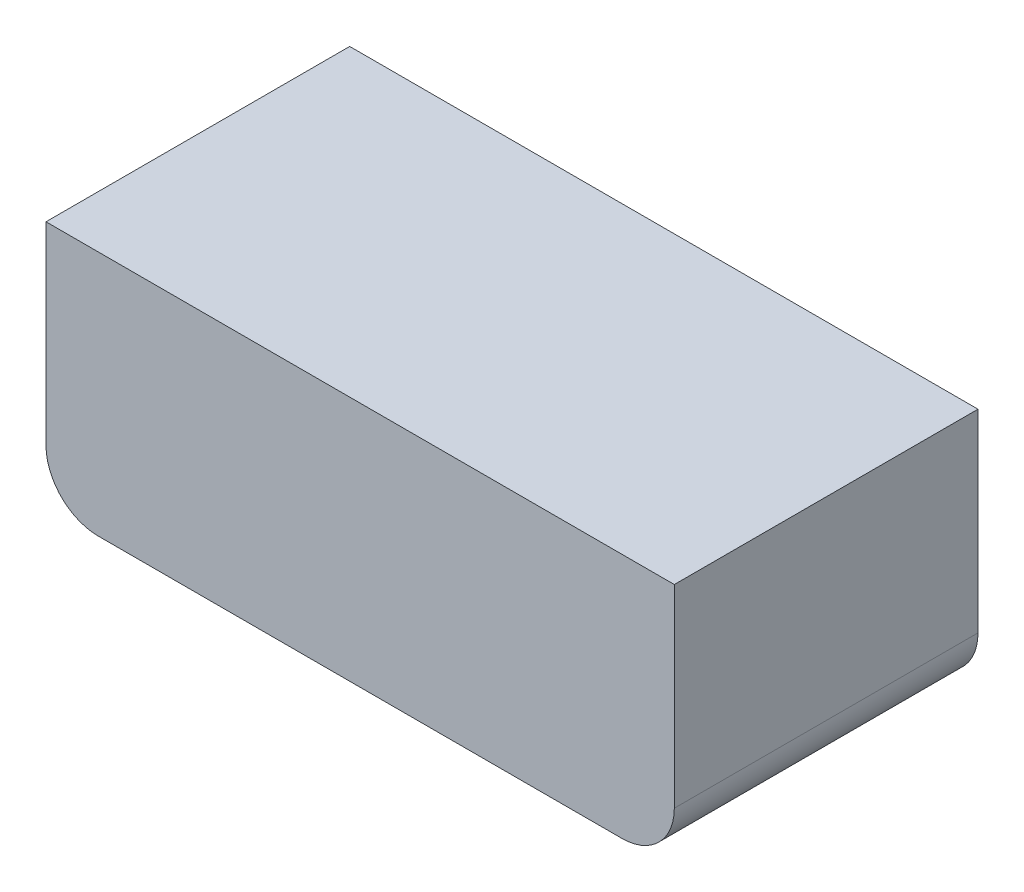
ISO-10303-21;
HEADER;
FILE_DESCRIPTION(('STEP AP214'),'2;1');
FILE_NAME('part.step','',(''),(''),'','','');
FILE_SCHEMA(('AUTOMOTIVE_DESIGN { 1 0 10303 214 1 1 1 1 }'));
ENDSEC;
DATA;
#1=APPLICATION_CONTEXT('core data for automotive mechanical design processes');
#2=APPLICATION_PROTOCOL_DEFINITION('international standard','automotive_design',2000,#1);
#3=PRODUCT_CONTEXT('',#1,'mechanical');
#4=PRODUCT('Part','Part','',(#3));
#5=PRODUCT_RELATED_PRODUCT_CATEGORY('part','',(#4));
#6=PRODUCT_DEFINITION_FORMATION('','',#4);
#7=PRODUCT_DEFINITION_CONTEXT('part definition',#1,'design');
#8=PRODUCT_DEFINITION('design','',#6,#7);
#9=PRODUCT_DEFINITION_SHAPE('','',#8);
#10=(LENGTH_UNIT() NAMED_UNIT(*) SI_UNIT(.MILLI.,.METRE.));
#11=(NAMED_UNIT(*) PLANE_ANGLE_UNIT() SI_UNIT($,.RADIAN.));
#12=(NAMED_UNIT(*) SI_UNIT($,.STERADIAN.) SOLID_ANGLE_UNIT());
#13=UNCERTAINTY_MEASURE_WITH_UNIT(LENGTH_MEASURE(1.E-05),#10,'distance_accuracy_value','');
#14=(GEOMETRIC_REPRESENTATION_CONTEXT(3) GLOBAL_UNCERTAINTY_ASSIGNED_CONTEXT((#13)) GLOBAL_UNIT_ASSIGNED_CONTEXT((#10,
#11,#12)) REPRESENTATION_CONTEXT('',''));
#15=CARTESIAN_POINT('',(0.,0.,0.));
#16=DIRECTION('',(0.,0.,1.));
#17=DIRECTION('',(1.,0.,0.));
#18=AXIS2_PLACEMENT_3D('',#15,#16,#17);
#19=CARTESIAN_POINT('',(32.1227999999928,-44.8418200005934,0.909160011896377));
#20=DIRECTION('',(0.,5.10341196927923E-12,-1.));
#21=DIRECTION('',(1.02069463991939E-11,1.,5.10341196927923E-12));
#22=AXIS2_PLACEMENT_3D('',#19,#20,#21);
#23=PLANE('',#22);
#24=DIRECTION('',(-1.02069463991939E-11,-1.,-5.10341196927923E-12));
#25=VECTOR('',#24,1.);
#26=CARTESIAN_POINT('',(32.0227999999966,-44.4718200005924,0.909160011898265));
#27=LINE('',#26,#25);
#28=CARTESIAN_POINT('',(32.0227999999966,-44.4718200005924,0.909160011898265));
#29=VERTEX_POINT('',#28);
#30=CARTESIAN_POINT('',(32.0227999999928,-44.8418200005924,0.909160011896377));
#31=VERTEX_POINT('',#30);
#32=EDGE_CURVE('E156',#29,#31,#27,.T.);
#33=ORIENTED_EDGE('',*,*,#32,.F.);
#34=DIRECTION('',(-1.,1.02069463991939E-11,0.));
#35=VECTOR('',#34,1.);
#36=CARTESIAN_POINT('',(32.0227999999966,-44.4718200005924,0.909160011898265));
#37=LINE('',#36,#35);
#38=CARTESIAN_POINT('',(33.2227999999966,-44.4718200006047,0.909160011898265));
#39=VERTEX_POINT('',#38);
#40=EDGE_CURVE('E27',#39,#29,#37,.T.);
#41=ORIENTED_EDGE('',*,*,#40,.F.);
#42=DIRECTION('',(1.02069463991939E-11,1.,5.10341196927923E-12));
#43=VECTOR('',#42,1.);
#44=CARTESIAN_POINT('',(33.2227999999966,-44.4718200006047,0.909160011898265));
#45=LINE('',#44,#43);
#46=CARTESIAN_POINT('',(33.2227999999928,-44.8418200006046,0.909160011896377));
#47=VERTEX_POINT('',#46);
#48=EDGE_CURVE('E111',#47,#39,#45,.T.);
#49=ORIENTED_EDGE('',*,*,#48,.F.);
#50=CARTESIAN_POINT('',(33.1227999999928,-44.8418200006036,0.909160011896377));
#51=DIRECTION('',(0.,-5.10341196927923E-12,1.));
#52=DIRECTION('',(1.02069463991939E-11,1.,5.10341196927923E-12));
#53=AXIS2_PLACEMENT_3D('',#50,#51,#52);
#54=CIRCLE('',#53,0.1);
#55=CARTESIAN_POINT('',(33.1227999999917,-44.9418200006036,0.909160011895866));
#56=VERTEX_POINT('',#55);
#57=EDGE_CURVE('E73',#56,#47,#54,.T.);
#58=ORIENTED_EDGE('',*,*,#57,.F.);
#59=DIRECTION('',(1.,-1.02067295587594E-11,0.));
#60=VECTOR('',#59,1.);
#61=CARTESIAN_POINT('',(32.1227999999917,-44.9418200005934,0.909160011895866));
#62=LINE('',#61,#60);
#63=CARTESIAN_POINT('',(32.1227999999917,-44.9418200005934,0.909160011895866));
#64=VERTEX_POINT('',#63);
#65=EDGE_CURVE('E131',#64,#56,#62,.T.);
#66=ORIENTED_EDGE('',*,*,#65,.F.);
#67=CARTESIAN_POINT('',(32.1227999999928,-44.8418200005934,0.909160011896377));
#68=DIRECTION('',(0.,-5.10341196927923E-12,1.));
#69=DIRECTION('',(1.02069463991939E-11,1.,5.10341196927923E-12));
#70=AXIS2_PLACEMENT_3D('',#67,#68,#69);
#71=CIRCLE('',#70,0.1);
#72=EDGE_CURVE('E127',#31,#64,#71,.T.);
#73=ORIENTED_EDGE('',*,*,#72,.F.);
#74=EDGE_LOOP('',(#33,#41,#49,#58,#66,#73));
#75=FACE_BOUND('',#74,.T.);
#76=ADVANCED_FACE('F16',(#75),#23,.T.);
#77=CARTESIAN_POINT('',(32.1227999999928,-44.8418200005964,1.48916001189638));
#78=DIRECTION('',(0.,5.10341196927923E-12,-1.));
#79=DIRECTION('',(1.02069463991939E-11,1.,5.10341196927923E-12));
#80=AXIS2_PLACEMENT_3D('',#77,#78,#79);
#81=PLANE('',#80);
#82=DIRECTION('',(-1.02069463991939E-11,-1.,-5.10341196927923E-12));
#83=VECTOR('',#82,1.);
#84=CARTESIAN_POINT('',(32.0227999999966,-44.4718200005954,1.48916001189826));
#85=LINE('',#84,#83);
#86=CARTESIAN_POINT('',(32.0227999999966,-44.4718200005954,1.48916001189826));
#87=VERTEX_POINT('',#86);
#88=CARTESIAN_POINT('',(32.0227999999928,-44.8418200005953,1.48916001189638));
#89=VERTEX_POINT('',#88);
#90=EDGE_CURVE('E123',#87,#89,#85,.T.);
#91=ORIENTED_EDGE('',*,*,#90,.T.);
#92=CARTESIAN_POINT('',(32.1227999999928,-44.8418200005964,1.48916001189638));
#93=DIRECTION('',(0.,-5.10341196927923E-12,1.));
#94=DIRECTION('',(1.02069463991939E-11,1.,5.10341196927923E-12));
#95=AXIS2_PLACEMENT_3D('',#92,#93,#94);
#96=CIRCLE('',#95,0.1);
#97=CARTESIAN_POINT('',(32.1227999999917,-44.9418200005964,1.48916001189587));
#98=VERTEX_POINT('',#97);
#99=EDGE_CURVE('E129',#89,#98,#96,.T.);
#100=ORIENTED_EDGE('',*,*,#99,.T.);
#101=DIRECTION('',(1.,-1.02067295587594E-11,0.));
#102=VECTOR('',#101,1.);
#103=CARTESIAN_POINT('',(32.1227999999917,-44.9418200005964,1.48916001189587));
#104=LINE('',#103,#102);
#105=CARTESIAN_POINT('',(33.1227999999917,-44.9418200006066,1.48916001189587));
#106=VERTEX_POINT('',#105);
#107=EDGE_CURVE('E88',#98,#106,#104,.T.);
#108=ORIENTED_EDGE('',*,*,#107,.T.);
#109=CARTESIAN_POINT('',(33.1227999999928,-44.8418200006066,1.48916001189638));
#110=DIRECTION('',(0.,-5.10341196927923E-12,1.));
#111=DIRECTION('',(1.02069463991939E-11,1.,5.10341196927923E-12));
#112=AXIS2_PLACEMENT_3D('',#109,#110,#111);
#113=CIRCLE('',#112,0.1);
#114=CARTESIAN_POINT('',(33.2227999999928,-44.8418200006076,1.48916001189638));
#115=VERTEX_POINT('',#114);
#116=EDGE_CURVE('E107',#106,#115,#113,.T.);
#117=ORIENTED_EDGE('',*,*,#116,.T.);
#118=DIRECTION('',(1.02069463991939E-11,1.,5.10341196927923E-12));
#119=VECTOR('',#118,1.);
#120=CARTESIAN_POINT('',(33.2227999999966,-44.4718200006076,1.48916001189826));
#121=LINE('',#120,#119);
#122=CARTESIAN_POINT('',(33.2227999999966,-44.4718200006076,1.48916001189826));
#123=VERTEX_POINT('',#122);
#124=EDGE_CURVE('E98',#115,#123,#121,.T.);
#125=ORIENTED_EDGE('',*,*,#124,.T.);
#126=DIRECTION('',(-1.,1.02069463991939E-11,0.));
#127=VECTOR('',#126,1.);
#128=CARTESIAN_POINT('',(32.0227999999966,-44.4718200005954,1.48916001189826));
#129=LINE('',#128,#127);
#130=EDGE_CURVE('E11',#123,#87,#129,.T.);
#131=ORIENTED_EDGE('',*,*,#130,.T.);
#132=EDGE_LOOP('',(#91,#100,#108,#117,#125,#131));
#133=FACE_BOUND('',#132,.T.);
#134=ADVANCED_FACE('F18',(#133),#81,.F.);
#135=CARTESIAN_POINT('',(32.0227999999966,-44.4718200005954,1.48916001189826));
#136=DIRECTION('',(-1.02069463991939E-11,-1.,-5.10341196927923E-12));
#137=DIRECTION('',(1.,-1.02069463991939E-11,0.));
#138=AXIS2_PLACEMENT_3D('',#135,#136,#137);
#139=PLANE('',#138);
#140=ORIENTED_EDGE('',*,*,#40,.T.);
#141=DIRECTION('',(0.,5.10341196927923E-12,-1.));
#142=VECTOR('',#141,1.);
#143=CARTESIAN_POINT('',(32.0227999999966,-44.4718200005954,1.48916001189826));
#144=LINE('',#143,#142);
#145=EDGE_CURVE('E125',#87,#29,#144,.T.);
#146=ORIENTED_EDGE('',*,*,#145,.F.);
#147=ORIENTED_EDGE('',*,*,#130,.F.);
#148=DIRECTION('',(0.,5.10341196927923E-12,-1.));
#149=VECTOR('',#148,1.);
#150=CARTESIAN_POINT('',(33.2227999999966,-44.4718200006076,1.48916001189826));
#151=LINE('',#150,#149);
#152=EDGE_CURVE('E20',#123,#39,#151,.T.);
#153=ORIENTED_EDGE('',*,*,#152,.T.);
#154=EDGE_LOOP('',(#140,#146,#147,#153));
#155=FACE_BOUND('',#154,.T.);
#156=ADVANCED_FACE('F212',(#155),#139,.F.);
#157=CARTESIAN_POINT('',(33.2227999999966,-44.4718200006076,1.48916001189826));
#158=DIRECTION('',(-1.,1.02069463991939E-11,0.));
#159=DIRECTION('',(-1.02069463991939E-11,-1.,-5.10341196927923E-12));
#160=AXIS2_PLACEMENT_3D('',#157,#158,#159);
#161=PLANE('',#160);
#162=ORIENTED_EDGE('',*,*,#48,.T.);
#163=ORIENTED_EDGE('',*,*,#152,.F.);
#164=ORIENTED_EDGE('',*,*,#124,.F.);
#165=DIRECTION('',(0.,5.10341196927923E-12,-1.));
#166=VECTOR('',#165,1.);
#167=CARTESIAN_POINT('',(33.2227999999928,-44.8418200006076,1.48916001189638));
#168=LINE('',#167,#166);
#169=EDGE_CURVE('E103',#115,#47,#168,.T.);
#170=ORIENTED_EDGE('',*,*,#169,.T.);
#171=EDGE_LOOP('',(#162,#163,#164,#170));
#172=FACE_BOUND('',#171,.T.);
#173=ADVANCED_FACE('F101',(#172),#161,.F.);
#174=CARTESIAN_POINT('',(33.1227999999928,-44.8418200006066,1.48916001189638));
#175=DIRECTION('',(0.,-5.10341196927923E-12,1.));
#176=DIRECTION('',(1.02069463991939E-11,1.,5.10341196927923E-12));
#177=AXIS2_PLACEMENT_3D('',#174,#175,#176);
#178=CYLINDRICAL_SURFACE('',#177,0.1);
#179=ORIENTED_EDGE('',*,*,#57,.T.);
#180=ORIENTED_EDGE('',*,*,#169,.F.);
#181=ORIENTED_EDGE('',*,*,#116,.F.);
#182=DIRECTION('',(0.,5.10341196927923E-12,-1.));
#183=VECTOR('',#182,1.);
#184=CARTESIAN_POINT('',(33.1227999999917,-44.9418200006066,1.48916001189587));
#185=LINE('',#184,#183);
#186=EDGE_CURVE('E138',#106,#56,#185,.T.);
#187=ORIENTED_EDGE('',*,*,#186,.T.);
#188=EDGE_LOOP('',(#179,#180,#181,#187));
#189=FACE_BOUND('',#188,.T.);
#190=ADVANCED_FACE('F112',(#189),#178,.T.);
#191=CARTESIAN_POINT('',(32.1227999999917,-44.9418200005964,1.48916001189587));
#192=DIRECTION('',(1.02067295587594E-11,1.,5.10341196927923E-12));
#193=DIRECTION('',(-1.,1.02067295587594E-11,0.));
#194=AXIS2_PLACEMENT_3D('',#191,#192,#193);
#195=PLANE('',#194);
#196=ORIENTED_EDGE('',*,*,#65,.T.);
#197=ORIENTED_EDGE('',*,*,#186,.F.);
#198=ORIENTED_EDGE('',*,*,#107,.F.);
#199=DIRECTION('',(0.,5.10341196927923E-12,-1.));
#200=VECTOR('',#199,1.);
#201=CARTESIAN_POINT('',(32.1227999999917,-44.9418200005964,1.48916001189587));
#202=LINE('',#201,#200);
#203=EDGE_CURVE('E132',#98,#64,#202,.T.);
#204=ORIENTED_EDGE('',*,*,#203,.T.);
#205=EDGE_LOOP('',(#196,#197,#198,#204));
#206=FACE_BOUND('',#205,.T.);
#207=ADVANCED_FACE('F196',(#206),#195,.F.);
#208=CARTESIAN_POINT('',(32.1227999999928,-44.8418200005964,1.48916001189638));
#209=DIRECTION('',(0.,-5.10341196927923E-12,1.));
#210=DIRECTION('',(1.02069463991939E-11,1.,5.10341196927923E-12));
#211=AXIS2_PLACEMENT_3D('',#208,#209,#210);
#212=CYLINDRICAL_SURFACE('',#211,0.1);
#213=ORIENTED_EDGE('',*,*,#72,.T.);
#214=ORIENTED_EDGE('',*,*,#203,.F.);
#215=ORIENTED_EDGE('',*,*,#99,.F.);
#216=DIRECTION('',(0.,5.10341196927923E-12,-1.));
#217=VECTOR('',#216,1.);
#218=CARTESIAN_POINT('',(32.0227999999928,-44.8418200005953,1.48916001189638));
#219=LINE('',#218,#217);
#220=EDGE_CURVE('E152',#89,#31,#219,.T.);
#221=ORIENTED_EDGE('',*,*,#220,.T.);
#222=EDGE_LOOP('',(#213,#214,#215,#221));
#223=FACE_BOUND('',#222,.T.);
#224=ADVANCED_FACE('F191',(#223),#212,.T.);
#225=CARTESIAN_POINT('',(32.0227999999966,-44.4718200005954,1.48916001189826));
#226=DIRECTION('',(1.,-1.02069463991939E-11,0.));
#227=DIRECTION('',(0.,-5.10341196927923E-12,1.));
#228=AXIS2_PLACEMENT_3D('',#225,#226,#227);
#229=PLANE('',#228);
#230=ORIENTED_EDGE('',*,*,#32,.T.);
#231=ORIENTED_EDGE('',*,*,#220,.F.);
#232=ORIENTED_EDGE('',*,*,#90,.F.);
#233=ORIENTED_EDGE('',*,*,#145,.T.);
#234=EDGE_LOOP('',(#230,#231,#232,#233));
#235=FACE_BOUND('',#234,.T.);
#236=ADVANCED_FACE('F195',(#235),#229,.F.);
#237=CLOSED_SHELL('',(#76,#134,#156,#173,#190,#207,#224,#236));
#238=MANIFOLD_SOLID_BREP('B1',#237);
#239=ADVANCED_BREP_SHAPE_REPRESENTATION('',(#18,#238),#14);
#240=SHAPE_DEFINITION_REPRESENTATION(#9,#239);
ENDSEC;
END-ISO-10303-21;
